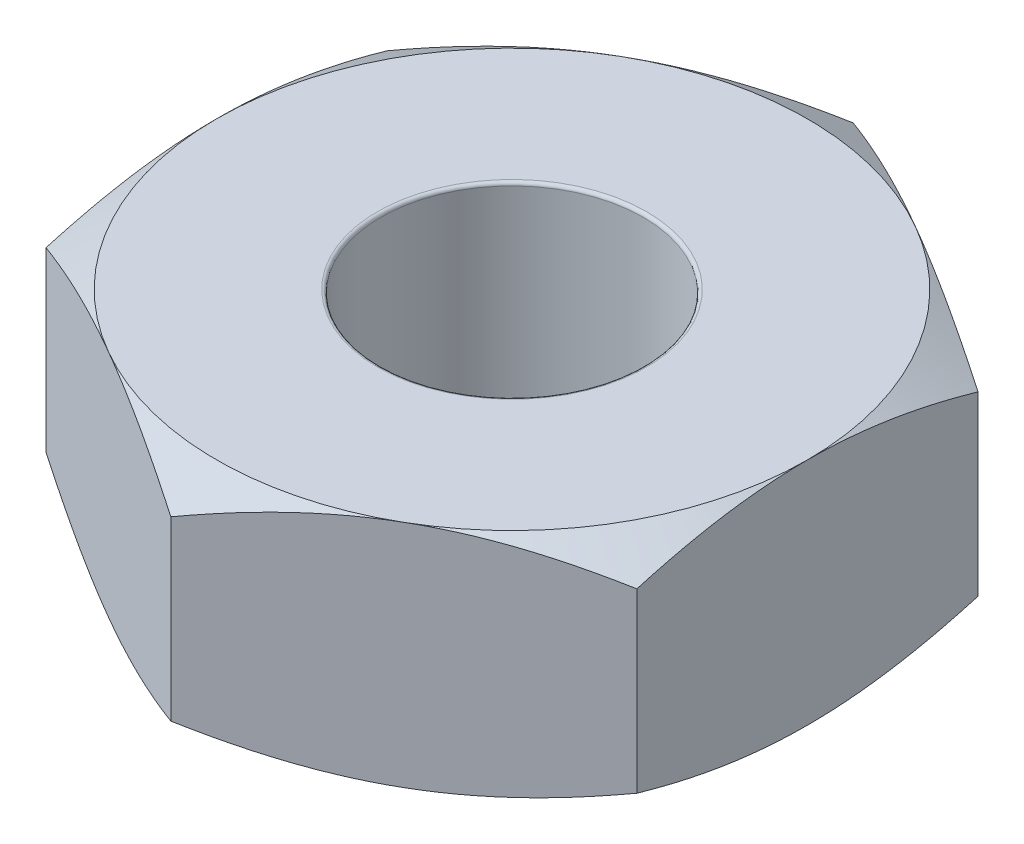
ISO-10303-21;
HEADER;
FILE_DESCRIPTION(('STEP AP214'),'2;1');
FILE_NAME('part.step','',(''),(''),'','','');
FILE_SCHEMA(('AUTOMOTIVE_DESIGN { 1 0 10303 214 1 1 1 1 }'));
ENDSEC;
DATA;
#1=APPLICATION_CONTEXT('core data for automotive mechanical design processes');
#2=APPLICATION_PROTOCOL_DEFINITION('international standard','automotive_design',2000,#1);
#3=PRODUCT_CONTEXT('',#1,'mechanical');
#4=PRODUCT('Part','Part','',(#3));
#5=PRODUCT_RELATED_PRODUCT_CATEGORY('part','',(#4));
#6=PRODUCT_DEFINITION_FORMATION('','',#4);
#7=PRODUCT_DEFINITION_CONTEXT('part definition',#1,'design');
#8=PRODUCT_DEFINITION('design','',#6,#7);
#9=PRODUCT_DEFINITION_SHAPE('','',#8);
#10=(LENGTH_UNIT() NAMED_UNIT(*) SI_UNIT(.MILLI.,.METRE.));
#11=(NAMED_UNIT(*) PLANE_ANGLE_UNIT() SI_UNIT($,.RADIAN.));
#12=(NAMED_UNIT(*) SI_UNIT($,.STERADIAN.) SOLID_ANGLE_UNIT());
#13=UNCERTAINTY_MEASURE_WITH_UNIT(LENGTH_MEASURE(1.E-05),#10,'distance_accuracy_value','');
#14=(GEOMETRIC_REPRESENTATION_CONTEXT(3) GLOBAL_UNCERTAINTY_ASSIGNED_CONTEXT((#13)) GLOBAL_UNIT_ASSIGNED_CONTEXT((#10,
#11,#12)) REPRESENTATION_CONTEXT('',''));
#15=CARTESIAN_POINT('',(0.,0.,0.));
#16=DIRECTION('',(0.,0.,1.));
#17=DIRECTION('',(1.,0.,0.));
#18=AXIS2_PLACEMENT_3D('',#15,#16,#17);
#19=CARTESIAN_POINT('',(-2.25,1.75,1.29903810567666));
#20=DIRECTION('',(0.5,0.,-0.866025403784439));
#21=DIRECTION('',(-0.866025403784439,0.,-0.5));
#22=AXIS2_PLACEMENT_3D('',#19,#20,#21);
#23=PLANE('',#22);
#24=CARTESIAN_POINT('',(0.000200000000000756,0.201028565434255,2.59819168140715));
#25=CARTESIAN_POINT('',(-0.0986772488143564,0.168055578047864,2.54110487518746));
#26=CARTESIAN_POINT('',(-0.198407997179093,0.138067535415598,2.48352530077259));
#27=CARTESIAN_POINT('',(-0.399596540220632,0.0857223882308779,2.36736904128969));
#28=CARTESIAN_POINT('',(-0.501057910502945,0.0633838027064786,2.30879029184485));
#29=CARTESIAN_POINT('',(-0.702723189801078,0.0286095576734189,2.19235878855587));
#30=CARTESIAN_POINT('',(-0.802896064976671,0.0159424738337184,2.13452395210774));
#31=CARTESIAN_POINT('',(-1.00371331260268,0.000818907417418956,2.01858206013295));
#32=CARTESIAN_POINT('',(-1.1043569548332,-0.00165009697600152,1.96047542619893));
#33=CARTESIAN_POINT('',(-1.29242516452656,0.00347837463602921,1.85189419470646));
#34=CARTESIAN_POINT('',(-1.37987784389126,0.00981663451512024,1.8014033667339));
#35=CARTESIAN_POINT('',(-1.55421343210877,0.0299076571898889,1.70075066794718));
#36=CARTESIAN_POINT('',(-1.64109573768829,0.0436672872310835,1.65058914543304));
#37=CARTESIAN_POINT('',(-1.81579095410174,0.0780662653506654,1.54972881521059));
#38=CARTESIAN_POINT('',(-1.90358174743525,0.0988514715826555,1.49904277704711));
#39=CARTESIAN_POINT('',(-2.07785373687759,0.146026087362979,1.39842679703037));
#40=CARTESIAN_POINT('',(-2.164337166751,0.172404408014302,1.34849556551251));
#41=CARTESIAN_POINT('',(-2.2502,0.201028565434254,1.29892263562282));
#42=B_SPLINE_CURVE_WITH_KNOTS('',3,(#24,#25,#26,#27,#28,#29,#30,#31,#32,#33,#34,#35,#36,#37,#38,
#39,#40,#41),.UNSPECIFIED.,.F.,.F.,(4,2,2,2,2,2,2,2,4),(0.,0.356658826016552,0.714175103224236,
1.06284241804968,1.41108149062516,1.71433394539794,2.01786749258222,2.32813511279245,
2.63779325460359),.UNSPECIFIED.);
#43=CARTESIAN_POINT('',(0.,0.200961894323341,2.59807621135332));
#44=VERTEX_POINT('',#43);
#45=CARTESIAN_POINT('',(-1.125,0.,1.94855715851499));
#46=VERTEX_POINT('',#45);
#47=EDGE_CURVE('E145',#44,#46,#42,.T.);
#48=ORIENTED_EDGE('',*,*,#47,.F.);
#49=DIRECTION('',(0.,-1.,0.));
#50=VECTOR('',#49,1.);
#51=CARTESIAN_POINT('',(0.,1.75,2.59807621135332));
#52=LINE('',#51,#50);
#53=CARTESIAN_POINT('',(0.,1.54903810567666,2.59807621135332));
#54=VERTEX_POINT('',#53);
#55=EDGE_CURVE('E160',#54,#44,#52,.T.);
#56=ORIENTED_EDGE('',*,*,#55,.F.);
#57=CARTESIAN_POINT('',(-2.2502,1.54897143456575,1.29892263562282));
#58=CARTESIAN_POINT('',(-2.15132275118564,1.58194442195214,1.35600944184252));
#59=CARTESIAN_POINT('',(-2.05159200282091,1.6119324645844,1.41358901625738));
#60=CARTESIAN_POINT('',(-1.85040345977937,1.66427761176912,1.52974527574028));
#61=CARTESIAN_POINT('',(-1.74894208949705,1.68661619729352,1.58832402518513));
#62=CARTESIAN_POINT('',(-1.54727681019892,1.72139044232658,1.7047555284741));
#63=CARTESIAN_POINT('',(-1.44710393502333,1.73405752616628,1.76259036492223));
#64=CARTESIAN_POINT('',(-1.24628668739732,1.74918109258258,1.87853225689702));
#65=CARTESIAN_POINT('',(-1.1456430451668,1.751650096976,1.93663889083104));
#66=CARTESIAN_POINT('',(-0.957574835473435,1.74652162536397,2.04522012232352));
#67=CARTESIAN_POINT('',(-0.870122156108742,1.74018336548488,2.09571095029608));
#68=CARTESIAN_POINT('',(-0.695786567891226,1.72009234281011,2.19636364908279));
#69=CARTESIAN_POINT('',(-0.608904262311711,1.70633271276892,2.24652517159694));
#70=CARTESIAN_POINT('',(-0.434209045898263,1.67193373464933,2.34738550181938));
#71=CARTESIAN_POINT('',(-0.346418252564746,1.65114852841734,2.39807153998286));
#72=CARTESIAN_POINT('',(-0.172146263122404,1.60397391263702,2.49868751999961));
#73=CARTESIAN_POINT('',(-0.0856628332489969,1.5775955919857,2.54861875151746));
#74=CARTESIAN_POINT('',(0.000200000000000693,1.54897143456575,2.59819168140715));
#75=B_SPLINE_CURVE_WITH_KNOTS('',3,(#57,#58,#59,#60,#61,#62,#63,#64,#65,#66,#67,#68,#69,#70,#71,
#72,#73,#74),.UNSPECIFIED.,.F.,.F.,(4,2,2,2,2,2,2,2,4),(0.,0.356658826016552,0.714175103224236,
1.06284241804968,1.41108149062516,1.71433394539794,2.01786749258222,2.32813511279245,
2.63779325460359),.UNSPECIFIED.);
#76=CARTESIAN_POINT('',(-1.125,1.75,1.94855715851499));
#77=VERTEX_POINT('',#76);
#78=EDGE_CURVE('E224',#77,#54,#75,.T.);
#79=ORIENTED_EDGE('',*,*,#78,.F.);
#80=CARTESIAN_POINT('',(-2.25,1.54903810567666,1.29903810567667));
#81=VERTEX_POINT('',#80);
#82=EDGE_CURVE('E231',#81,#77,#75,.T.);
#83=ORIENTED_EDGE('',*,*,#82,.F.);
#84=DIRECTION('',(0.,-1.,0.));
#85=VECTOR('',#84,1.);
#86=CARTESIAN_POINT('',(-2.25,1.75,1.29903810567666));
#87=LINE('',#86,#85);
#88=CARTESIAN_POINT('',(-2.25,0.200961894323341,1.29903810567666));
#89=VERTEX_POINT('',#88);
#90=EDGE_CURVE('E239',#81,#89,#87,.T.);
#91=ORIENTED_EDGE('',*,*,#90,.T.);
#92=EDGE_CURVE('E213',#46,#89,#42,.T.);
#93=ORIENTED_EDGE('',*,*,#92,.F.);
#94=EDGE_LOOP('',(#48,#56,#79,#83,#91,#93));
#95=FACE_BOUND('',#94,.T.);
#96=ADVANCED_FACE('F35',(#95),#23,.F.);
#97=CARTESIAN_POINT('',(0.,1.75,2.59807621135332));
#98=DIRECTION('',(-0.5,0.,-0.866025403784439));
#99=DIRECTION('',(-0.866025403784439,0.,0.5));
#100=AXIS2_PLACEMENT_3D('',#97,#98,#99);
#101=PLANE('',#100);
#102=CARTESIAN_POINT('',(2.2502,0.201028565434255,1.29892263562282));
#103=CARTESIAN_POINT('',(2.15132275118564,0.168055578047864,1.35600944184252));
#104=CARTESIAN_POINT('',(2.05159200282091,0.138067535415598,1.41358901625738));
#105=CARTESIAN_POINT('',(1.85040345977937,0.0857223882308783,1.52974527574028));
#106=CARTESIAN_POINT('',(1.74894208949705,0.063383802706479,1.58832402518513));
#107=CARTESIAN_POINT('',(1.54727681019892,0.0286095576734192,1.7047555284741));
#108=CARTESIAN_POINT('',(1.44710393502333,0.0159424738337187,1.76259036492223));
#109=CARTESIAN_POINT('',(1.24628668739732,0.000818907417419334,1.87853225689703));
#110=CARTESIAN_POINT('',(1.1456430451668,-0.00165009697600091,1.93663889083104));
#111=CARTESIAN_POINT('',(0.957574835473435,0.00347837463602974,2.04522012232352));
#112=CARTESIAN_POINT('',(0.870122156108742,0.00981663451512054,2.09571095029608));
#113=CARTESIAN_POINT('',(0.695786567891227,0.0299076571898892,2.19636364908279));
#114=CARTESIAN_POINT('',(0.608904262311713,0.0436672872310839,2.24652517159694));
#115=CARTESIAN_POINT('',(0.434209045898265,0.0780662653506659,2.34738550181938));
#116=CARTESIAN_POINT('',(0.346418252564747,0.0988514715826558,2.39807153998286));
#117=CARTESIAN_POINT('',(0.172146263122406,0.146026087362979,2.49868751999961));
#118=CARTESIAN_POINT('',(0.0856628332489987,0.172404408014302,2.54861875151746));
#119=CARTESIAN_POINT('',(-0.000199999999999222,0.201028565434255,2.59819168140715));
#120=B_SPLINE_CURVE_WITH_KNOTS('',3,(#102,#103,#104,#105,#106,#107,#108,#109,#110,#111,#112,
#113,#114,#115,#116,#117,#118,#119),.UNSPECIFIED.,.F.,.F.,(4,2,2,2,2,2,2,2,4),(0.,
0.356658826016552,0.714175103224236,1.06284241804968,1.41108149062516,1.71433394539794,
2.01786749258222,2.32813511279245,2.63779325460359),.UNSPECIFIED.);
#121=CARTESIAN_POINT('',(2.25,0.200961894323341,1.29903810567666));
#122=VERTEX_POINT('',#121);
#123=CARTESIAN_POINT('',(1.125,0.,1.94855715851499));
#124=VERTEX_POINT('',#123);
#125=EDGE_CURVE('E124',#122,#124,#120,.T.);
#126=ORIENTED_EDGE('',*,*,#125,.F.);
#127=DIRECTION('',(0.,-1.,0.));
#128=VECTOR('',#127,1.);
#129=CARTESIAN_POINT('',(2.25,1.75,1.29903810567666));
#130=LINE('',#129,#128);
#131=CARTESIAN_POINT('',(2.25,1.54903810567666,1.29903810567666));
#132=VERTEX_POINT('',#131);
#133=EDGE_CURVE('E251',#132,#122,#130,.T.);
#134=ORIENTED_EDGE('',*,*,#133,.F.);
#135=CARTESIAN_POINT('',(-0.000199999999999207,1.54897143456575,2.59819168140715));
#136=CARTESIAN_POINT('',(0.0986772488143579,1.58194442195214,2.54110487518746));
#137=CARTESIAN_POINT('',(0.198407997179094,1.6119324645844,2.48352530077259));
#138=CARTESIAN_POINT('',(0.399596540220633,1.66427761176912,2.36736904128969));
#139=CARTESIAN_POINT('',(0.501057910502946,1.68661619729352,2.30879029184485));
#140=CARTESIAN_POINT('',(0.702723189801079,1.72139044232658,2.19235878855587));
#141=CARTESIAN_POINT('',(0.802896064976673,1.73405752616628,2.13452395210774));
#142=CARTESIAN_POINT('',(1.00371331260268,1.74918109258258,2.01858206013295));
#143=CARTESIAN_POINT('',(1.1043569548332,1.751650096976,1.96047542619893));
#144=CARTESIAN_POINT('',(1.29242516452657,1.74652162536397,1.85189419470646));
#145=CARTESIAN_POINT('',(1.37987784389126,1.74018336548488,1.8014033667339));
#146=CARTESIAN_POINT('',(1.55421343210877,1.72009234281011,1.70075066794718));
#147=CARTESIAN_POINT('',(1.64109573768829,1.70633271276892,1.65058914543304));
#148=CARTESIAN_POINT('',(1.81579095410174,1.67193373464933,1.54972881521059));
#149=CARTESIAN_POINT('',(1.90358174743525,1.65114852841734,1.49904277704711));
#150=CARTESIAN_POINT('',(2.0778537368776,1.60397391263702,1.39842679703037));
#151=CARTESIAN_POINT('',(2.164337166751,1.5775955919857,1.34849556551251));
#152=CARTESIAN_POINT('',(2.2502,1.54897143456575,1.29892263562282));
#153=B_SPLINE_CURVE_WITH_KNOTS('',3,(#135,#136,#137,#138,#139,#140,#141,#142,#143,#144,#145,
#146,#147,#148,#149,#150,#151,#152),.UNSPECIFIED.,.F.,.F.,(4,2,2,2,2,2,2,2,4),(0.,
0.356658826016552,0.714175103224236,1.06284241804968,1.41108149062516,1.71433394539794,
2.01786749258222,2.32813511279245,2.63779325460359),.UNSPECIFIED.);
#154=CARTESIAN_POINT('',(1.125,1.75,1.94855715851499));
#155=VERTEX_POINT('',#154);
#156=EDGE_CURVE('E233',#155,#132,#153,.T.);
#157=ORIENTED_EDGE('',*,*,#156,.F.);
#158=EDGE_CURVE('E232',#54,#155,#153,.T.);
#159=ORIENTED_EDGE('',*,*,#158,.F.);
#160=ORIENTED_EDGE('',*,*,#55,.T.);
#161=EDGE_CURVE('E137',#124,#44,#120,.T.);
#162=ORIENTED_EDGE('',*,*,#161,.F.);
#163=EDGE_LOOP('',(#126,#134,#157,#159,#160,#162));
#164=FACE_BOUND('',#163,.T.);
#165=ADVANCED_FACE('F157',(#164),#101,.F.);
#166=CARTESIAN_POINT('',(2.25,1.75,1.29903810567666));
#167=DIRECTION('',(-1.,0.,0.));
#168=DIRECTION('',(0.,0.,1.));
#169=AXIS2_PLACEMENT_3D('',#166,#167,#168);
#170=PLANE('',#169);
#171=CARTESIAN_POINT('',(2.25,1.56555831138049,-4.42213047046897));
#172=CARTESIAN_POINT('',(2.25,1.51253641089187,-4.31907609605377));
#173=CARTESIAN_POINT('',(2.25,1.45980461522268,-4.21587114895435));
#174=CARTESIAN_POINT('',(2.25,1.35506687206804,-4.00909136564838));
#175=CARTESIAN_POINT('',(2.25,1.30306093826251,-3.90551652251669));
#176=CARTESIAN_POINT('',(2.25,1.19983819414006,-3.69776226755876));
#177=CARTESIAN_POINT('',(2.25,1.14862281407765,-3.59358214386062));
#178=CARTESIAN_POINT('',(2.25,1.04726863927474,-3.38469686395629));
#179=CARTESIAN_POINT('',(2.25,0.997129859883961,-3.27999170029052));
#180=CARTESIAN_POINT('',(2.25,0.895590975392254,-3.06443773664851));
#181=CARTESIAN_POINT('',(2.25,0.844262813896654,-2.95355495083985));
#182=CARTESIAN_POINT('',(2.25,0.743488704008481,-2.73093810810308));
#183=CARTESIAN_POINT('',(2.25,0.694042704613714,-2.6192040743404));
#184=CARTESIAN_POINT('',(2.25,0.597606517380621,-2.39476559407176));
#185=CARTESIAN_POINT('',(2.25,0.550614681662905,-2.28206185948416));
#186=CARTESIAN_POINT('',(2.25,0.459779963230871,-2.05535508627361));
#187=CARTESIAN_POINT('',(2.25,0.415937817282044,-1.94135175083155));
#188=CARTESIAN_POINT('',(2.25,0.325629065729293,-1.69318584033386));
#189=CARTESIAN_POINT('',(2.25,0.279891243493501,-1.55875423344575));
#190=CARTESIAN_POINT('',(2.25,0.196186335346582,-1.28751781965287));
#191=CARTESIAN_POINT('',(2.25,0.158215303092899,-1.15071425647396));
#192=CARTESIAN_POINT('',(2.25,0.0934100246854139,-0.877191892519576));
#193=CARTESIAN_POINT('',(2.25,0.0663767276583869,-0.74052148124589));
#194=CARTESIAN_POINT('',(2.25,0.0252694807344893,-0.465223193243969));
#195=CARTESIAN_POINT('',(2.25,0.0111879530299646,-0.326596509361764));
#196=CARTESIAN_POINT('',(2.25,0.00112514059449648,-0.117223951792124));
#197=CARTESIAN_POINT('',(2.25,-0.000357653579398746,-0.0467155663666338));
#198=CARTESIAN_POINT('',(2.25,0.000502767822567237,0.0942778450423073));
#199=CARTESIAN_POINT('',(2.25,0.00284598504344014,0.164762871015702));
#200=CARTESIAN_POINT('',(2.25,0.0155320953718862,0.375901114139416));
#201=CARTESIAN_POINT('',(2.25,0.0315313215434617,0.516240180351075));
#202=CARTESIAN_POINT('',(2.25,0.076927586603595,0.797536431240899));
#203=CARTESIAN_POINT('',(2.25,0.106589144783226,0.938448674669497));
#204=CARTESIAN_POINT('',(2.25,0.176240629866023,1.21767236088611));
#205=CARTESIAN_POINT('',(2.25,0.216233678272229,1.35598300406735));
#206=CARTESIAN_POINT('',(2.25,0.301848870671621,1.62417819674141));
#207=CARTESIAN_POINT('',(2.25,0.34714996058763,1.75416736002763));
#208=CARTESIAN_POINT('',(2.25,0.44280152310107,2.01228919589807));
#209=CARTESIAN_POINT('',(2.25,0.493153199709669,2.14042141743363));
#210=CARTESIAN_POINT('',(2.25,0.597611255264981,2.39528540480933));
#211=CARTESIAN_POINT('',(2.25,0.651721394221921,2.52201561679053));
#212=CARTESIAN_POINT('',(2.25,0.762705830640598,2.77426151692868));
#213=CARTESIAN_POINT('',(2.25,0.819580277044825,2.89977713920496));
#214=CARTESIAN_POINT('',(2.25,0.932150499113664,3.14277870156181));
#215=CARTESIAN_POINT('',(2.25,0.987731600848742,3.26031797968369));
#216=CARTESIAN_POINT('',(2.25,1.10035122751633,3.49469938792213));
#217=CARTESIAN_POINT('',(2.25,1.15738979940018,3.61154149542992));
#218=CARTESIAN_POINT('',(2.25,1.27243073348915,3.84427750639044));
#219=CARTESIAN_POINT('',(2.25,1.33042936901701,3.96017325620989));
#220=CARTESIAN_POINT('',(2.25,1.44735195230743,4.19148501960206));
#221=CARTESIAN_POINT('',(2.25,1.5062758208671,4.30690107318009));
#222=CARTESIAN_POINT('',(2.25,1.56555831138049,4.42213047046897));
#223=B_SPLINE_CURVE_WITH_KNOTS('',3,(#171,#172,#173,#174,#175,#176,#177,#178,#179,#180,#181,
#182,#183,#184,#185,#186,#187,#188,#189,#190,#191,#192,#193,#194,#195,#196,#197,#198,#199,#200,
#201,#202,#203,#204,#205,#206,#207,#208,#209,#210,#211,#212,#213,#214,#215,#216,#217,#218,#219,
#220,#221,#222),.UNSPECIFIED.,.F.,.F.,(4,2,2,2,2,2,2,2,2,2,2,2,2,2,2,2,2,2,2,2,2,2,2,2,2,4),(0.,
0.347684660648865,0.695375865091879,1.04363591220691,1.39190092137216,1.75844707629515,
2.12498329159302,2.4912701408257,2.85764239361152,3.28347290105065,3.70908650157083,
4.12656251242164,4.54379411118024,4.75527202620087,4.96675003214744,5.38969802732589,
5.82120323135264,6.25283896092085,6.66567429964863,7.07860828930034,7.49196150428248,
7.90533701571904,8.29537955819919,8.68543468149341,9.07422449696779,9.46298121030579),.UNSPECIFIED.);
#224=CARTESIAN_POINT('',(2.25,0.200961894323341,-1.29903810567666));
#225=VERTEX_POINT('',#224);
#226=CARTESIAN_POINT('',(2.25,0.,0.));
#227=VERTEX_POINT('',#226);
#228=EDGE_CURVE('E50',#225,#227,#223,.T.);
#229=ORIENTED_EDGE('',*,*,#228,.F.);
#230=DIRECTION('',(0.,-1.,0.));
#231=VECTOR('',#230,1.);
#232=CARTESIAN_POINT('',(2.25,1.75,-1.29903810567666));
#233=LINE('',#232,#231);
#234=CARTESIAN_POINT('',(2.25,1.54903810567666,-1.29903810567666));
#235=VERTEX_POINT('',#234);
#236=EDGE_CURVE('E248',#235,#225,#233,.T.);
#237=ORIENTED_EDGE('',*,*,#236,.F.);
#238=CARTESIAN_POINT('',(2.25,0.184441688619511,4.42213047046897));
#239=CARTESIAN_POINT('',(2.25,0.237463589108125,4.31907609605377));
#240=CARTESIAN_POINT('',(2.25,0.290195384777319,4.21587114895435));
#241=CARTESIAN_POINT('',(2.25,0.394933127931959,4.00909136564838));
#242=CARTESIAN_POINT('',(2.25,0.446939061737493,3.90551652251669));
#243=CARTESIAN_POINT('',(2.25,0.550161805859938,3.69776226755876));
#244=CARTESIAN_POINT('',(2.25,0.601377185922349,3.59358214386062));
#245=CARTESIAN_POINT('',(2.25,0.702731360725255,3.38469686395628));
#246=CARTESIAN_POINT('',(2.25,0.752870140116039,3.27999170029052));
#247=CARTESIAN_POINT('',(2.25,0.854409024607746,3.06443773664851));
#248=CARTESIAN_POINT('',(2.25,0.905737186103346,2.95355495083985));
#249=CARTESIAN_POINT('',(2.25,1.00651129599152,2.73093810810308));
#250=CARTESIAN_POINT('',(2.25,1.05595729538629,2.6192040743404));
#251=CARTESIAN_POINT('',(2.25,1.15239348261938,2.39476559407176));
#252=CARTESIAN_POINT('',(2.25,1.19938531833709,2.28206185948416));
#253=CARTESIAN_POINT('',(2.25,1.29022003676913,2.05535508627361));
#254=CARTESIAN_POINT('',(2.25,1.33406218271796,1.94135175083155));
#255=CARTESIAN_POINT('',(2.25,1.42437093427071,1.69318584033386));
#256=CARTESIAN_POINT('',(2.25,1.4701087565065,1.55875423344575));
#257=CARTESIAN_POINT('',(2.25,1.55381366465342,1.28751781965287));
#258=CARTESIAN_POINT('',(2.25,1.5917846969071,1.15071425647396));
#259=CARTESIAN_POINT('',(2.25,1.65658997531459,0.877191892519575));
#260=CARTESIAN_POINT('',(2.25,1.68362327234161,0.740521481245889));
#261=CARTESIAN_POINT('',(2.25,1.72473051926551,0.465223193243969));
#262=CARTESIAN_POINT('',(2.25,1.73881204697004,0.326596509361764));
#263=CARTESIAN_POINT('',(2.25,1.7488748594055,0.117223951792123));
#264=CARTESIAN_POINT('',(2.25,1.7503576535794,0.0467155663666327));
#265=CARTESIAN_POINT('',(2.25,1.74949723217743,-0.0942778450423084));
#266=CARTESIAN_POINT('',(2.25,1.74715401495656,-0.164762871015702));
#267=CARTESIAN_POINT('',(2.25,1.73446790462811,-0.375901114139416));
#268=CARTESIAN_POINT('',(2.25,1.71846867845654,-0.516240180351076));
#269=CARTESIAN_POINT('',(2.25,1.67307241339641,-0.7975364312409));
#270=CARTESIAN_POINT('',(2.25,1.64341085521677,-0.938448674669498));
#271=CARTESIAN_POINT('',(2.25,1.57375937013398,-1.21767236088611));
#272=CARTESIAN_POINT('',(2.25,1.53376632172777,-1.35598300406735));
#273=CARTESIAN_POINT('',(2.25,1.44815112932838,-1.62417819674141));
#274=CARTESIAN_POINT('',(2.25,1.40285003941237,-1.75416736002763));
#275=CARTESIAN_POINT('',(2.25,1.30719847689893,-2.01228919589808));
#276=CARTESIAN_POINT('',(2.25,1.25684680029033,-2.14042141743363));
#277=CARTESIAN_POINT('',(2.25,1.15238874473502,-2.39528540480934));
#278=CARTESIAN_POINT('',(2.25,1.09827860577808,-2.52201561679053));
#279=CARTESIAN_POINT('',(2.25,0.987294169359401,-2.77426151692869));
#280=CARTESIAN_POINT('',(2.25,0.930419722955175,-2.89977713920496));
#281=CARTESIAN_POINT('',(2.25,0.817849500886336,-3.14277870156182));
#282=CARTESIAN_POINT('',(2.25,0.762268399151258,-3.26031797968369));
#283=CARTESIAN_POINT('',(2.25,0.649648772483665,-3.49469938792213));
#284=CARTESIAN_POINT('',(2.25,0.592610200599821,-3.61154149542992));
#285=CARTESIAN_POINT('',(2.25,0.477569266510853,-3.84427750639044));
#286=CARTESIAN_POINT('',(2.25,0.419570630982986,-3.96017325620989));
#287=CARTESIAN_POINT('',(2.25,0.302648047692569,-4.19148501960206));
#288=CARTESIAN_POINT('',(2.25,0.243724179132898,-4.30690107318009));
#289=CARTESIAN_POINT('',(2.25,0.184441688619511,-4.42213047046897));
#290=B_SPLINE_CURVE_WITH_KNOTS('',3,(#238,#239,#240,#241,#242,#243,#244,#245,#246,#247,#248,
#249,#250,#251,#252,#253,#254,#255,#256,#257,#258,#259,#260,#261,#262,#263,#264,#265,#266,#267,
#268,#269,#270,#271,#272,#273,#274,#275,#276,#277,#278,#279,#280,#281,#282,#283,#284,#285,#286,
#287,#288,#289),.UNSPECIFIED.,.F.,.F.,(4,2,2,2,2,2,2,2,2,2,2,2,2,2,2,2,2,2,2,2,2,2,2,2,2,4),(0.,
0.347684660648864,0.695375865091879,1.04363591220691,1.39190092137216,1.75844707629515,
2.12498329159302,2.4912701408257,2.85764239361152,3.28347290105065,3.70908650157083,
4.12656251242164,4.54379411118024,4.75527202620087,4.96675003214744,5.38969802732589,
5.82120323135264,6.25283896092085,6.66567429964863,7.07860828930034,7.49196150428248,
7.90533701571905,8.29537955819919,8.68543468149342,9.07422449696779,9.46298121030579),.UNSPECIFIED.);
#291=CARTESIAN_POINT('',(2.25,1.75,0.));
#292=VERTEX_POINT('',#291);
#293=EDGE_CURVE('E289',#292,#235,#290,.T.);
#294=ORIENTED_EDGE('',*,*,#293,.F.);
#295=EDGE_CURVE('E294',#132,#292,#290,.T.);
#296=ORIENTED_EDGE('',*,*,#295,.F.);
#297=ORIENTED_EDGE('',*,*,#133,.T.);
#298=EDGE_CURVE('E131',#227,#122,#223,.T.);
#299=ORIENTED_EDGE('',*,*,#298,.F.);
#300=EDGE_LOOP('',(#229,#237,#294,#296,#297,#299));
#301=FACE_BOUND('',#300,.T.);
#302=ADVANCED_FACE('F295',(#301),#170,.F.);
#303=CARTESIAN_POINT('',(2.25,1.75,-1.29903810567666));
#304=DIRECTION('',(-0.5,0.,0.866025403784439));
#305=DIRECTION('',(0.866025403784439,0.,0.5));
#306=AXIS2_PLACEMENT_3D('',#303,#304,#305);
#307=PLANE('',#306);
#308=CARTESIAN_POINT('',(-0.000200000000000446,0.201028565434254,-2.59819168140715));
#309=CARTESIAN_POINT('',(0.0986772488143568,0.168055578047863,-2.54110487518745));
#310=CARTESIAN_POINT('',(0.198407997179093,0.138067535415598,-2.48352530077259));
#311=CARTESIAN_POINT('',(0.399596540220632,0.0857223882308777,-2.36736904128969));
#312=CARTESIAN_POINT('',(0.501057910502945,0.0633838027064786,-2.30879029184485));
#313=CARTESIAN_POINT('',(0.702723189801078,0.0286095576734189,-2.19235878855587));
#314=CARTESIAN_POINT('',(0.802896064976672,0.0159424738337184,-2.13452395210774));
#315=CARTESIAN_POINT('',(1.00371331260268,0.00081890741741882,-2.01858206013295));
#316=CARTESIAN_POINT('',(1.1043569548332,-0.00165009697600173,-1.96047542619893));
#317=CARTESIAN_POINT('',(1.29242516452656,0.00347837463602904,-1.85189419470646));
#318=CARTESIAN_POINT('',(1.37987784389126,0.00981663451512015,-1.8014033667339));
#319=CARTESIAN_POINT('',(1.55421343210877,0.0299076571898889,-1.70075066794718));
#320=CARTESIAN_POINT('',(1.64109573768829,0.0436672872310834,-1.65058914543304));
#321=CARTESIAN_POINT('',(1.81579095410174,0.0780662653506653,-1.54972881521059));
#322=CARTESIAN_POINT('',(1.90358174743525,0.0988514715826554,-1.49904277704711));
#323=CARTESIAN_POINT('',(2.07785373687759,0.146026087362979,-1.39842679703037));
#324=CARTESIAN_POINT('',(2.164337166751,0.172404408014302,-1.34849556551251));
#325=CARTESIAN_POINT('',(2.2502,0.201028565434254,-1.29892263562282));
#326=B_SPLINE_CURVE_WITH_KNOTS('',3,(#308,#309,#310,#311,#312,#313,#314,#315,#316,#317,#318,
#319,#320,#321,#322,#323,#324,#325),.UNSPECIFIED.,.F.,.F.,(4,2,2,2,2,2,2,2,4),(0.,
0.356658826016552,0.714175103224236,1.06284241804968,1.41108149062516,1.71433394539794,
2.01786749258222,2.32813511279245,2.63779325460359),.UNSPECIFIED.);
#327=CARTESIAN_POINT('',(0.,0.200961894323341,-2.59807621135332));
#328=VERTEX_POINT('',#327);
#329=CARTESIAN_POINT('',(1.125,0.,-1.94855715851499));
#330=VERTEX_POINT('',#329);
#331=EDGE_CURVE('E58',#328,#330,#326,.T.);
#332=ORIENTED_EDGE('',*,*,#331,.F.);
#333=DIRECTION('',(0.,-1.,0.));
#334=VECTOR('',#333,1.);
#335=CARTESIAN_POINT('',(0.,1.75,-2.59807621135332));
#336=LINE('',#335,#334);
#337=CARTESIAN_POINT('',(0.,1.54903810567666,-2.59807621135332));
#338=VERTEX_POINT('',#337);
#339=EDGE_CURVE('E245',#338,#328,#336,.T.);
#340=ORIENTED_EDGE('',*,*,#339,.F.);
#341=CARTESIAN_POINT('',(2.2502,1.54897143456575,-1.29892263562282));
#342=CARTESIAN_POINT('',(2.15132275118564,1.58194442195214,-1.35600944184252));
#343=CARTESIAN_POINT('',(2.05159200282091,1.6119324645844,-1.41358901625738));
#344=CARTESIAN_POINT('',(1.85040345977937,1.66427761176912,-1.52974527574028));
#345=CARTESIAN_POINT('',(1.74894208949705,1.68661619729352,-1.58832402518513));
#346=CARTESIAN_POINT('',(1.54727681019892,1.72139044232658,-1.7047555284741));
#347=CARTESIAN_POINT('',(1.44710393502333,1.73405752616628,-1.76259036492223));
#348=CARTESIAN_POINT('',(1.24628668739732,1.74918109258258,-1.87853225689702));
#349=CARTESIAN_POINT('',(1.1456430451668,1.751650096976,-1.93663889083104));
#350=CARTESIAN_POINT('',(0.957574835473434,1.74652162536397,-2.04522012232352));
#351=CARTESIAN_POINT('',(0.870122156108742,1.74018336548488,-2.09571095029608));
#352=CARTESIAN_POINT('',(0.695786567891226,1.72009234281011,-2.19636364908279));
#353=CARTESIAN_POINT('',(0.608904262311711,1.70633271276892,-2.24652517159694));
#354=CARTESIAN_POINT('',(0.434209045898264,1.67193373464933,-2.34738550181938));
#355=CARTESIAN_POINT('',(0.346418252564746,1.65114852841734,-2.39807153998286));
#356=CARTESIAN_POINT('',(0.172146263122405,1.60397391263702,-2.49868751999961));
#357=CARTESIAN_POINT('',(0.0856628332489972,1.5775955919857,-2.54861875151746));
#358=CARTESIAN_POINT('',(-0.000200000000000367,1.54897143456575,-2.59819168140715));
#359=B_SPLINE_CURVE_WITH_KNOTS('',3,(#341,#342,#343,#344,#345,#346,#347,#348,#349,#350,#351,
#352,#353,#354,#355,#356,#357,#358),.UNSPECIFIED.,.F.,.F.,(4,2,2,2,2,2,2,2,4),(0.,
0.356658826016552,0.714175103224236,1.06284241804968,1.41108149062516,1.71433394539794,
2.01786749258222,2.32813511279245,2.63779325460359),.UNSPECIFIED.);
#360=CARTESIAN_POINT('',(1.125,1.75,-1.94855715851499));
#361=VERTEX_POINT('',#360);
#362=EDGE_CURVE('E283',#361,#338,#359,.T.);
#363=ORIENTED_EDGE('',*,*,#362,.F.);
#364=EDGE_CURVE('E288',#235,#361,#359,.T.);
#365=ORIENTED_EDGE('',*,*,#364,.F.);
#366=ORIENTED_EDGE('',*,*,#236,.T.);
#367=EDGE_CURVE('E136',#330,#225,#326,.T.);
#368=ORIENTED_EDGE('',*,*,#367,.F.);
#369=EDGE_LOOP('',(#332,#340,#363,#365,#366,#368));
#370=FACE_BOUND('',#369,.T.);
#371=ADVANCED_FACE('F270',(#370),#307,.F.);
#372=CARTESIAN_POINT('',(0.,1.75,-2.59807621135332));
#373=DIRECTION('',(0.5,0.,0.866025403784439));
#374=DIRECTION('',(0.866025403784439,0.,-0.5));
#375=AXIS2_PLACEMENT_3D('',#372,#373,#374);
#376=PLANE('',#375);
#377=CARTESIAN_POINT('',(-2.2502,0.201028565434254,-1.29892263562282));
#378=CARTESIAN_POINT('',(-2.15132275118564,0.168055578047864,-1.35600944184252));
#379=CARTESIAN_POINT('',(-2.05159200282091,0.138067535415598,-1.41358901625738));
#380=CARTESIAN_POINT('',(-1.85040345977937,0.0857223882308779,-1.52974527574028));
#381=CARTESIAN_POINT('',(-1.74894208949706,0.0633838027064785,-1.58832402518512));
#382=CARTESIAN_POINT('',(-1.54727681019892,0.0286095576734186,-1.7047555284741));
#383=CARTESIAN_POINT('',(-1.44710393502333,0.0159424738337181,-1.76259036492223));
#384=CARTESIAN_POINT('',(-1.24628668739732,0.000818907417418722,-1.87853225689702));
#385=CARTESIAN_POINT('',(-1.1456430451668,-0.00165009697600166,-1.93663889083104));
#386=CARTESIAN_POINT('',(-0.957574835473436,0.00347837463602898,-2.04522012232352));
#387=CARTESIAN_POINT('',(-0.870122156108743,0.00981663451511988,-2.09571095029608));
#388=CARTESIAN_POINT('',(-0.695786567891227,0.0299076571898885,-2.19636364908279));
#389=CARTESIAN_POINT('',(-0.608904262311712,0.0436672872310831,-2.24652517159694));
#390=CARTESIAN_POINT('',(-0.434209045898265,0.0780662653506651,-2.34738550181938));
#391=CARTESIAN_POINT('',(-0.346418252564747,0.0988514715826552,-2.39807153998286));
#392=CARTESIAN_POINT('',(-0.172146263122405,0.146026087362979,-2.49868751999961));
#393=CARTESIAN_POINT('',(-0.085662833248998,0.172404408014302,-2.54861875151746));
#394=CARTESIAN_POINT('',(0.000199999999999667,0.201028565434254,-2.59819168140715));
#395=B_SPLINE_CURVE_WITH_KNOTS('',3,(#377,#378,#379,#380,#381,#382,#383,#384,#385,#386,#387,
#388,#389,#390,#391,#392,#393,#394),.UNSPECIFIED.,.F.,.F.,(4,2,2,2,2,2,2,2,4),(0.,
0.356658826016552,0.714175103224236,1.06284241804968,1.41108149062516,1.71433394539794,
2.01786749258222,2.32813511279245,2.63779325460359),.UNSPECIFIED.);
#396=CARTESIAN_POINT('',(-2.25,0.200961894323335,-1.29903810567667));
#397=VERTEX_POINT('',#396);
#398=CARTESIAN_POINT('',(-1.125,0.,-1.94855715851499));
#399=VERTEX_POINT('',#398);
#400=EDGE_CURVE('E207',#397,#399,#395,.T.);
#401=ORIENTED_EDGE('',*,*,#400,.F.);
#402=DIRECTION('',(0.,-1.,0.));
#403=VECTOR('',#402,1.);
#404=CARTESIAN_POINT('',(-2.25,1.75,-1.29903810567666));
#405=LINE('',#404,#403);
#406=CARTESIAN_POINT('',(-2.25,1.54903810567666,-1.29903810567666));
#407=VERTEX_POINT('',#406);
#408=EDGE_CURVE('E242',#407,#397,#405,.T.);
#409=ORIENTED_EDGE('',*,*,#408,.F.);
#410=CARTESIAN_POINT('',(0.000199999999999599,1.54897143456575,-2.59819168140715));
#411=CARTESIAN_POINT('',(-0.0986772488143576,1.58194442195214,-2.54110487518745));
#412=CARTESIAN_POINT('',(-0.198407997179094,1.6119324645844,-2.48352530077259));
#413=CARTESIAN_POINT('',(-0.399596540220633,1.66427761176912,-2.36736904128969));
#414=CARTESIAN_POINT('',(-0.501057910502946,1.68661619729352,-2.30879029184485));
#415=CARTESIAN_POINT('',(-0.702723189801079,1.72139044232658,-2.19235878855587));
#416=CARTESIAN_POINT('',(-0.802896064976672,1.73405752616628,-2.13452395210774));
#417=CARTESIAN_POINT('',(-1.00371331260268,1.74918109258258,-2.01858206013295));
#418=CARTESIAN_POINT('',(-1.1043569548332,1.751650096976,-1.96047542619893));
#419=CARTESIAN_POINT('',(-1.29242516452657,1.74652162536397,-1.85189419470646));
#420=CARTESIAN_POINT('',(-1.37987784389126,1.74018336548488,-1.8014033667339));
#421=CARTESIAN_POINT('',(-1.55421343210877,1.72009234281011,-1.70075066794718));
#422=CARTESIAN_POINT('',(-1.64109573768829,1.70633271276892,-1.65058914543303));
#423=CARTESIAN_POINT('',(-1.81579095410174,1.67193373464933,-1.54972881521059));
#424=CARTESIAN_POINT('',(-1.90358174743525,1.65114852841734,-1.49904277704711));
#425=CARTESIAN_POINT('',(-2.0778537368776,1.60397391263702,-1.39842679703037));
#426=CARTESIAN_POINT('',(-2.164337166751,1.5775955919857,-1.34849556551251));
#427=CARTESIAN_POINT('',(-2.2502,1.54897143456575,-1.29892263562282));
#428=B_SPLINE_CURVE_WITH_KNOTS('',3,(#410,#411,#412,#413,#414,#415,#416,#417,#418,#419,#420,
#421,#422,#423,#424,#425,#426,#427),.UNSPECIFIED.,.F.,.F.,(4,2,2,2,2,2,2,2,4),(0.,
0.356658826016552,0.714175103224236,1.06284241804968,1.41108149062516,1.71433394539794,
2.01786749258222,2.32813511279245,2.63779325460359),.UNSPECIFIED.);
#429=CARTESIAN_POINT('',(-1.125,1.75,-1.94855715851499));
#430=VERTEX_POINT('',#429);
#431=EDGE_CURVE('E275',#430,#407,#428,.T.);
#432=ORIENTED_EDGE('',*,*,#431,.F.);
#433=EDGE_CURVE('E281',#338,#430,#428,.T.);
#434=ORIENTED_EDGE('',*,*,#433,.F.);
#435=ORIENTED_EDGE('',*,*,#339,.T.);
#436=EDGE_CURVE('E161',#399,#328,#395,.T.);
#437=ORIENTED_EDGE('',*,*,#436,.F.);
#438=EDGE_LOOP('',(#401,#409,#432,#434,#435,#437));
#439=FACE_BOUND('',#438,.T.);
#440=ADVANCED_FACE('F264',(#439),#376,.F.);
#441=CARTESIAN_POINT('',(-2.25,1.75,-1.29903810567666));
#442=DIRECTION('',(1.,0.,0.));
#443=DIRECTION('',(0.,0.,-1.));
#444=AXIS2_PLACEMENT_3D('',#441,#442,#443);
#445=PLANE('',#444);
#446=CARTESIAN_POINT('',(-2.25,1.56555831138049,4.42213047046897));
#447=CARTESIAN_POINT('',(-2.25,1.51253641089187,4.31907609605377));
#448=CARTESIAN_POINT('',(-2.25,1.45980461522268,4.21587114895435));
#449=CARTESIAN_POINT('',(-2.25,1.35506687206804,4.00909136564838));
#450=CARTESIAN_POINT('',(-2.25,1.30306093826251,3.90551652251669));
#451=CARTESIAN_POINT('',(-2.25,1.19983819414006,3.69776226755876));
#452=CARTESIAN_POINT('',(-2.25,1.14862281407765,3.59358214386062));
#453=CARTESIAN_POINT('',(-2.25,1.04726863927474,3.38469686395628));
#454=CARTESIAN_POINT('',(-2.25,0.99712985988396,3.27999170029052));
#455=CARTESIAN_POINT('',(-2.25,0.895590975392253,3.06443773664851));
#456=CARTESIAN_POINT('',(-2.25,0.844262813896654,2.95355495083985));
#457=CARTESIAN_POINT('',(-2.25,0.743488704008481,2.73093810810308));
#458=CARTESIAN_POINT('',(-2.25,0.694042704613714,2.6192040743404));
#459=CARTESIAN_POINT('',(-2.25,0.597606517380621,2.39476559407176));
#460=CARTESIAN_POINT('',(-2.25,0.550614681662905,2.28206185948416));
#461=CARTESIAN_POINT('',(-2.25,0.459779963230871,2.05535508627361));
#462=CARTESIAN_POINT('',(-2.25,0.415937817282044,1.94135175083155));
#463=CARTESIAN_POINT('',(-2.25,0.325629065729293,1.69318584033386));
#464=CARTESIAN_POINT('',(-2.25,0.279891243493502,1.55875423344575));
#465=CARTESIAN_POINT('',(-2.25,0.196186335346582,1.28751781965287));
#466=CARTESIAN_POINT('',(-2.25,0.158215303092898,1.15071425647396));
#467=CARTESIAN_POINT('',(-2.25,0.0934100246854137,0.877191892519575));
#468=CARTESIAN_POINT('',(-2.25,0.0663767276583869,0.74052148124589));
#469=CARTESIAN_POINT('',(-2.25,0.0252694807344894,0.465223193243969));
#470=CARTESIAN_POINT('',(-2.25,0.0111879530299646,0.326596509361764));
#471=CARTESIAN_POINT('',(-2.25,0.00112514059449647,0.117223951792124));
#472=CARTESIAN_POINT('',(-2.25,-0.000357653579398761,0.046715566366634));
#473=CARTESIAN_POINT('',(-2.25,0.00050276782256725,-0.0942778450423068));
#474=CARTESIAN_POINT('',(-2.25,0.00284598504344017,-0.164762871015701));
#475=CARTESIAN_POINT('',(-2.25,0.0155320953718862,-0.375901114139415));
#476=CARTESIAN_POINT('',(-2.25,0.0315313215434617,-0.516240180351074));
#477=CARTESIAN_POINT('',(-2.25,0.0769275866035949,-0.797536431240898));
#478=CARTESIAN_POINT('',(-2.25,0.106589144783226,-0.938448674669497));
#479=CARTESIAN_POINT('',(-2.25,0.176240629866023,-1.21767236088611));
#480=CARTESIAN_POINT('',(-2.25,0.216233678272229,-1.35598300406735));
#481=CARTESIAN_POINT('',(-2.25,0.301848870671621,-1.62417819674141));
#482=CARTESIAN_POINT('',(-2.25,0.34714996058763,-1.75416736002763));
#483=CARTESIAN_POINT('',(-2.25,0.44280152310107,-2.01228919589808));
#484=CARTESIAN_POINT('',(-2.25,0.493153199709669,-2.14042141743363));
#485=CARTESIAN_POINT('',(-2.25,0.597611255264981,-2.39528540480934));
#486=CARTESIAN_POINT('',(-2.25,0.651721394221922,-2.52201561679053));
#487=CARTESIAN_POINT('',(-2.25,0.762705830640599,-2.77426151692868));
#488=CARTESIAN_POINT('',(-2.25,0.819580277044825,-2.89977713920496));
#489=CARTESIAN_POINT('',(-2.25,0.932150499113664,-3.14277870156181));
#490=CARTESIAN_POINT('',(-2.25,0.987731600848741,-3.26031797968368));
#491=CARTESIAN_POINT('',(-2.25,1.10035122751633,-3.49469938792213));
#492=CARTESIAN_POINT('',(-2.25,1.15738979940018,-3.61154149542992));
#493=CARTESIAN_POINT('',(-2.25,1.27243073348915,-3.84427750639044));
#494=CARTESIAN_POINT('',(-2.25,1.33042936901701,-3.96017325620988));
#495=CARTESIAN_POINT('',(-2.25,1.44735195230743,-4.19148501960206));
#496=CARTESIAN_POINT('',(-2.25,1.5062758208671,-4.30690107318009));
#497=CARTESIAN_POINT('',(-2.25,1.56555831138049,-4.42213047046896));
#498=B_SPLINE_CURVE_WITH_KNOTS('',3,(#446,#447,#448,#449,#450,#451,#452,#453,#454,#455,#456,
#457,#458,#459,#460,#461,#462,#463,#464,#465,#466,#467,#468,#469,#470,#471,#472,#473,#474,#475,
#476,#477,#478,#479,#480,#481,#482,#483,#484,#485,#486,#487,#488,#489,#490,#491,#492,#493,#494,
#495,#496,#497),.UNSPECIFIED.,.F.,.F.,(4,2,2,2,2,2,2,2,2,2,2,2,2,2,2,2,2,2,2,2,2,2,2,2,2,4),(0.,
0.347684660648864,0.695375865091879,1.04363591220691,1.39190092137216,1.75844707629514,
2.12498329159302,2.4912701408257,2.85764239361152,3.28347290105065,3.70908650157083,
4.12656251242164,4.54379411118024,4.75527202620086,4.96675003214744,5.38969802732589,
5.82120323135264,6.25283896092085,6.66567429964863,7.07860828930034,7.49196150428248,
7.90533701571904,8.29537955819919,8.68543468149341,9.07422449696779,9.46298121030578),.UNSPECIFIED.);
#499=CARTESIAN_POINT('',(-2.25,0.,0.));
#500=VERTEX_POINT('',#499);
#501=EDGE_CURVE('E416',#89,#500,#498,.T.);
#502=ORIENTED_EDGE('',*,*,#501,.F.);
#503=ORIENTED_EDGE('',*,*,#90,.F.);
#504=CARTESIAN_POINT('',(-2.25,0.184441688619511,-4.42213047046896));
#505=CARTESIAN_POINT('',(-2.25,0.237463589108126,-4.31907609605377));
#506=CARTESIAN_POINT('',(-2.25,0.290195384777319,-4.21587114895434));
#507=CARTESIAN_POINT('',(-2.25,0.394933127931959,-4.00909136564838));
#508=CARTESIAN_POINT('',(-2.25,0.446939061737493,-3.90551652251669));
#509=CARTESIAN_POINT('',(-2.25,0.550161805859938,-3.69776226755876));
#510=CARTESIAN_POINT('',(-2.25,0.601377185922349,-3.59358214386062));
#511=CARTESIAN_POINT('',(-2.25,0.702731360725256,-3.38469686395628));
#512=CARTESIAN_POINT('',(-2.25,0.75287014011604,-3.27999170029052));
#513=CARTESIAN_POINT('',(-2.25,0.854409024607746,-3.0644377366485));
#514=CARTESIAN_POINT('',(-2.25,0.905737186103346,-2.95355495083985));
#515=CARTESIAN_POINT('',(-2.25,1.00651129599152,-2.73093810810307));
#516=CARTESIAN_POINT('',(-2.25,1.05595729538629,-2.61920407434039));
#517=CARTESIAN_POINT('',(-2.25,1.15239348261938,-2.39476559407176));
#518=CARTESIAN_POINT('',(-2.25,1.1993853183371,-2.28206185948415));
#519=CARTESIAN_POINT('',(-2.25,1.29022003676913,-2.05535508627361));
#520=CARTESIAN_POINT('',(-2.25,1.33406218271796,-1.94135175083154));
#521=CARTESIAN_POINT('',(-2.25,1.42437093427071,-1.69318584033385));
#522=CARTESIAN_POINT('',(-2.25,1.4701087565065,-1.55875423344574));
#523=CARTESIAN_POINT('',(-2.25,1.55381366465342,-1.28751781965287));
#524=CARTESIAN_POINT('',(-2.25,1.5917846969071,-1.15071425647396));
#525=CARTESIAN_POINT('',(-2.25,1.65658997531459,-0.877191892519573));
#526=CARTESIAN_POINT('',(-2.25,1.68362327234161,-0.740521481245888));
#527=CARTESIAN_POINT('',(-2.25,1.72473051926551,-0.465223193243967));
#528=CARTESIAN_POINT('',(-2.25,1.73881204697004,-0.326596509361762));
#529=CARTESIAN_POINT('',(-2.25,1.7488748594055,-0.117223951792122));
#530=CARTESIAN_POINT('',(-2.25,1.7503576535794,-0.0467155663666314));
#531=CARTESIAN_POINT('',(-2.25,1.74949723217743,0.0942778450423094));
#532=CARTESIAN_POINT('',(-2.25,1.74715401495656,0.164762871015703));
#533=CARTESIAN_POINT('',(-2.25,1.73446790462811,0.375901114139417));
#534=CARTESIAN_POINT('',(-2.25,1.71846867845654,0.516240180351077));
#535=CARTESIAN_POINT('',(-2.25,1.67307241339641,0.797536431240901));
#536=CARTESIAN_POINT('',(-2.25,1.64341085521677,0.9384486746695));
#537=CARTESIAN_POINT('',(-2.25,1.57375937013398,1.21767236088611));
#538=CARTESIAN_POINT('',(-2.25,1.53376632172777,1.35598300406735));
#539=CARTESIAN_POINT('',(-2.25,1.44815112932838,1.62417819674141));
#540=CARTESIAN_POINT('',(-2.25,1.40285003941237,1.75416736002763));
#541=CARTESIAN_POINT('',(-2.25,1.30719847689893,2.01228919589808));
#542=CARTESIAN_POINT('',(-2.25,1.25684680029033,2.14042141743363));
#543=CARTESIAN_POINT('',(-2.25,1.15238874473502,2.39528540480934));
#544=CARTESIAN_POINT('',(-2.25,1.09827860577808,2.52201561679053));
#545=CARTESIAN_POINT('',(-2.25,0.987294169359401,2.77426151692869));
#546=CARTESIAN_POINT('',(-2.25,0.930419722955175,2.89977713920496));
#547=CARTESIAN_POINT('',(-2.25,0.817849500886336,3.14277870156182));
#548=CARTESIAN_POINT('',(-2.25,0.762268399151258,3.26031797968369));
#549=CARTESIAN_POINT('',(-2.25,0.649648772483666,3.49469938792213));
#550=CARTESIAN_POINT('',(-2.25,0.592610200599822,3.61154149542992));
#551=CARTESIAN_POINT('',(-2.25,0.477569266510854,3.84427750639044));
#552=CARTESIAN_POINT('',(-2.25,0.419570630982987,3.96017325620989));
#553=CARTESIAN_POINT('',(-2.25,0.30264804769257,4.19148501960206));
#554=CARTESIAN_POINT('',(-2.25,0.243724179132899,4.30690107318009));
#555=CARTESIAN_POINT('',(-2.25,0.184441688619512,4.42213047046897));
#556=B_SPLINE_CURVE_WITH_KNOTS('',3,(#504,#505,#506,#507,#508,#509,#510,#511,#512,#513,#514,
#515,#516,#517,#518,#519,#520,#521,#522,#523,#524,#525,#526,#527,#528,#529,#530,#531,#532,#533,
#534,#535,#536,#537,#538,#539,#540,#541,#542,#543,#544,#545,#546,#547,#548,#549,#550,#551,#552,
#553,#554,#555),.UNSPECIFIED.,.F.,.F.,(4,2,2,2,2,2,2,2,2,2,2,2,2,2,2,2,2,2,2,2,2,2,2,2,2,4),(0.,
0.347684660648865,0.695375865091879,1.04363591220691,1.39190092137216,1.75844707629515,
2.12498329159303,2.4912701408257,2.85764239361152,3.28347290105065,3.70908650157083,
4.12656251242164,4.54379411118025,4.75527202620087,4.96675003214744,5.38969802732589,
5.82120323135265,6.25283896092085,6.66567429964863,7.07860828930035,7.49196150428248,
7.90533701571905,8.29537955819919,8.68543468149341,9.07422449696779,9.46298121030578),.UNSPECIFIED.);
#557=CARTESIAN_POINT('',(-2.25,1.75,0.));
#558=VERTEX_POINT('',#557);
#559=EDGE_CURVE('E254',#558,#81,#556,.T.);
#560=ORIENTED_EDGE('',*,*,#559,.F.);
#561=EDGE_CURVE('E149',#407,#558,#556,.T.);
#562=ORIENTED_EDGE('',*,*,#561,.F.);
#563=ORIENTED_EDGE('',*,*,#408,.T.);
#564=EDGE_CURVE('E198',#500,#397,#498,.T.);
#565=ORIENTED_EDGE('',*,*,#564,.F.);
#566=EDGE_LOOP('',(#502,#503,#560,#562,#563,#565));
#567=FACE_BOUND('',#566,.T.);
#568=ADVANCED_FACE('F260',(#567),#445,.F.);
#569=CARTESIAN_POINT('',(0.,0.,0.));
#570=DIRECTION('',(0.,1.,0.));
#571=DIRECTION('',(0.,0.,1.));
#572=AXIS2_PLACEMENT_3D('',#569,#570,#571);
#573=PLANE('',#572);
#574=CARTESIAN_POINT('',(0.,0.,0.));
#575=DIRECTION('',(0.,1.,0.));
#576=DIRECTION('',(0.,0.,1.));
#577=AXIS2_PLACEMENT_3D('',#574,#575,#576);
#578=CIRCLE('',#577,1.025);
#579=CARTESIAN_POINT('',(0.,0.,1.025));
#580=VERTEX_POINT('',#579);
#581=EDGE_CURVE('E154',#580,#580,#578,.T.);
#582=ORIENTED_EDGE('',*,*,#581,.T.);
#583=EDGE_LOOP('',(#582));
#584=FACE_BOUND('',#583,.T.);
#585=CARTESIAN_POINT('',(0.,0.,0.));
#586=DIRECTION('',(0.,1.,0.));
#587=DIRECTION('',(0.,0.,1.));
#588=AXIS2_PLACEMENT_3D('',#585,#586,#587);
#589=CIRCLE('',#588,2.25);
#590=EDGE_CURVE('E128',#124,#227,#589,.T.);
#591=ORIENTED_EDGE('',*,*,#590,.F.);
#592=EDGE_CURVE('E142',#46,#124,#589,.T.);
#593=ORIENTED_EDGE('',*,*,#592,.F.);
#594=EDGE_CURVE('E148',#500,#46,#589,.T.);
#595=ORIENTED_EDGE('',*,*,#594,.F.);
#596=EDGE_CURVE('E413',#399,#500,#589,.T.);
#597=ORIENTED_EDGE('',*,*,#596,.F.);
#598=EDGE_CURVE('E155',#330,#399,#589,.T.);
#599=ORIENTED_EDGE('',*,*,#598,.F.);
#600=CARTESIAN_POINT('',(0.,0.,0.));
#601=DIRECTION('',(0.,-1.,0.));
#602=DIRECTION('',(0.,0.,-1.));
#603=AXIS2_PLACEMENT_3D('',#600,#601,#602);
#604=CIRCLE('',#603,2.25);
#605=EDGE_CURVE('E153',#330,#227,#604,.T.);
#606=ORIENTED_EDGE('',*,*,#605,.T.);
#607=EDGE_LOOP('',(#591,#593,#595,#597,#599,#606));
#608=FACE_BOUND('',#607,.T.);
#609=ADVANCED_FACE('F151',(#584,#608),#573,.F.);
#610=CARTESIAN_POINT('',(0.,1.75,0.));
#611=DIRECTION('',(0.,1.,0.));
#612=DIRECTION('',(0.,0.,1.));
#613=AXIS2_PLACEMENT_3D('',#610,#611,#612);
#614=PLANE('',#613);
#615=CARTESIAN_POINT('',(0.,1.75,0.));
#616=DIRECTION('',(0.,1.,0.));
#617=DIRECTION('',(0.,0.,1.));
#618=AXIS2_PLACEMENT_3D('',#615,#616,#617);
#619=CIRCLE('',#618,1.025);
#620=CARTESIAN_POINT('',(0.,1.75,1.025));
#621=VERTEX_POINT('',#620);
#622=EDGE_CURVE('E12',#621,#621,#619,.F.);
#623=ORIENTED_EDGE('',*,*,#622,.T.);
#624=EDGE_LOOP('',(#623));
#625=FACE_BOUND('',#624,.T.);
#626=CARTESIAN_POINT('',(0.,1.75,0.));
#627=DIRECTION('',(0.,1.,0.));
#628=DIRECTION('',(0.,0.,1.));
#629=AXIS2_PLACEMENT_3D('',#626,#627,#628);
#630=CIRCLE('',#629,2.25);
#631=EDGE_CURVE('E307',#77,#155,#630,.T.);
#632=ORIENTED_EDGE('',*,*,#631,.T.);
#633=EDGE_CURVE('E282',#155,#292,#630,.T.);
#634=ORIENTED_EDGE('',*,*,#633,.T.);
#635=EDGE_CURVE('E316',#292,#361,#630,.T.);
#636=ORIENTED_EDGE('',*,*,#635,.T.);
#637=EDGE_CURVE('E327',#361,#430,#630,.T.);
#638=ORIENTED_EDGE('',*,*,#637,.T.);
#639=EDGE_CURVE('E329',#430,#558,#630,.T.);
#640=ORIENTED_EDGE('',*,*,#639,.T.);
#641=EDGE_CURVE('E328',#558,#77,#630,.T.);
#642=ORIENTED_EDGE('',*,*,#641,.T.);
#643=EDGE_LOOP('',(#632,#634,#636,#638,#640,#642));
#644=FACE_BOUND('',#643,.T.);
#645=ADVANCED_FACE('F323',(#625,#644),#614,.T.);
#646=CARTESIAN_POINT('',(0.,1.75,0.));
#647=DIRECTION('',(0.,-1.,0.));
#648=DIRECTION('',(0.,0.,-1.));
#649=AXIS2_PLACEMENT_3D('',#646,#647,#648);
#650=CYLINDRICAL_SURFACE('',#649,1.);
#651=CARTESIAN_POINT('',(0.,0.0250000000000001,0.));
#652=DIRECTION('',(0.,1.,0.));
#653=DIRECTION('',(0.,0.,1.));
#654=AXIS2_PLACEMENT_3D('',#651,#652,#653);
#655=CIRCLE('',#654,1.);
#656=CARTESIAN_POINT('',(0.,0.0250000000000001,1.));
#657=VERTEX_POINT('',#656);
#658=EDGE_CURVE('E43',#657,#657,#655,.F.);
#659=ORIENTED_EDGE('',*,*,#658,.T.);
#660=EDGE_LOOP('',(#659));
#661=FACE_BOUND('',#660,.T.);
#662=CARTESIAN_POINT('',(0.,1.725,0.));
#663=DIRECTION('',(0.,1.,0.));
#664=DIRECTION('',(0.,0.,1.));
#665=AXIS2_PLACEMENT_3D('',#662,#663,#664);
#666=CIRCLE('',#665,1.);
#667=CARTESIAN_POINT('',(0.,1.725,1.));
#668=VERTEX_POINT('',#667);
#669=EDGE_CURVE('E382',#668,#668,#666,.T.);
#670=ORIENTED_EDGE('',*,*,#669,.T.);
#671=EDGE_LOOP('',(#670));
#672=FACE_BOUND('',#671,.T.);
#673=ADVANCED_FACE('F368',(#661,#672),#650,.F.);
#674=CARTESIAN_POINT('',(0.,1.75,0.));
#675=DIRECTION('',(0.,-1.,0.));
#676=DIRECTION('',(0.,0.,1.));
#677=AXIS2_PLACEMENT_3D('',#674,#675,#676);
#678=CONICAL_SURFACE('',#677,2.25,1.0471975511966);
#679=ORIENTED_EDGE('',*,*,#82,.T.);
#680=ORIENTED_EDGE('',*,*,#641,.F.);
#681=ORIENTED_EDGE('',*,*,#559,.T.);
#682=EDGE_LOOP('',(#679,#680,#681));
#683=FACE_BOUND('',#682,.T.);
#684=ADVANCED_FACE('F190',(#683),#678,.T.);
#685=ORIENTED_EDGE('',*,*,#431,.T.);
#686=ORIENTED_EDGE('',*,*,#561,.T.);
#687=ORIENTED_EDGE('',*,*,#639,.F.);
#688=EDGE_LOOP('',(#685,#686,#687));
#689=FACE_BOUND('',#688,.T.);
#690=ADVANCED_FACE('F341',(#689),#678,.T.);
#691=ORIENTED_EDGE('',*,*,#362,.T.);
#692=ORIENTED_EDGE('',*,*,#433,.T.);
#693=ORIENTED_EDGE('',*,*,#637,.F.);
#694=EDGE_LOOP('',(#691,#692,#693));
#695=FACE_BOUND('',#694,.T.);
#696=ADVANCED_FACE('F334',(#695),#678,.T.);
#697=ORIENTED_EDGE('',*,*,#293,.T.);
#698=ORIENTED_EDGE('',*,*,#364,.T.);
#699=ORIENTED_EDGE('',*,*,#635,.F.);
#700=EDGE_LOOP('',(#697,#698,#699));
#701=FACE_BOUND('',#700,.T.);
#702=ADVANCED_FACE('F315',(#701),#678,.T.);
#703=ORIENTED_EDGE('',*,*,#156,.T.);
#704=ORIENTED_EDGE('',*,*,#295,.T.);
#705=ORIENTED_EDGE('',*,*,#633,.F.);
#706=EDGE_LOOP('',(#703,#704,#705));
#707=FACE_BOUND('',#706,.T.);
#708=ADVANCED_FACE('F353',(#707),#678,.T.);
#709=ORIENTED_EDGE('',*,*,#78,.T.);
#710=ORIENTED_EDGE('',*,*,#158,.T.);
#711=ORIENTED_EDGE('',*,*,#631,.F.);
#712=EDGE_LOOP('',(#709,#710,#711));
#713=FACE_BOUND('',#712,.T.);
#714=ADVANCED_FACE('F352',(#713),#678,.T.);
#715=CARTESIAN_POINT('',(0.,0.,0.));
#716=DIRECTION('',(0.,1.,0.));
#717=DIRECTION('',(0.,0.,-1.));
#718=AXIS2_PLACEMENT_3D('',#715,#716,#717);
#719=CONICAL_SURFACE('',#718,2.25,1.0471975511966);
#720=ORIENTED_EDGE('',*,*,#161,.T.);
#721=ORIENTED_EDGE('',*,*,#47,.T.);
#722=ORIENTED_EDGE('',*,*,#592,.T.);
#723=EDGE_LOOP('',(#720,#721,#722));
#724=FACE_BOUND('',#723,.T.);
#725=ADVANCED_FACE('F143',(#724),#719,.T.);
#726=ORIENTED_EDGE('',*,*,#92,.T.);
#727=ORIENTED_EDGE('',*,*,#501,.T.);
#728=ORIENTED_EDGE('',*,*,#594,.T.);
#729=EDGE_LOOP('',(#726,#727,#728));
#730=FACE_BOUND('',#729,.T.);
#731=ADVANCED_FACE('F399',(#730),#719,.T.);
#732=ORIENTED_EDGE('',*,*,#400,.T.);
#733=ORIENTED_EDGE('',*,*,#596,.T.);
#734=ORIENTED_EDGE('',*,*,#564,.T.);
#735=EDGE_LOOP('',(#732,#733,#734));
#736=FACE_BOUND('',#735,.T.);
#737=ADVANCED_FACE('F189',(#736),#719,.T.);
#738=ORIENTED_EDGE('',*,*,#331,.T.);
#739=ORIENTED_EDGE('',*,*,#598,.T.);
#740=ORIENTED_EDGE('',*,*,#436,.T.);
#741=EDGE_LOOP('',(#738,#739,#740));
#742=FACE_BOUND('',#741,.T.);
#743=ADVANCED_FACE('F188',(#742),#719,.T.);
#744=ORIENTED_EDGE('',*,*,#228,.T.);
#745=ORIENTED_EDGE('',*,*,#605,.F.);
#746=ORIENTED_EDGE('',*,*,#367,.T.);
#747=EDGE_LOOP('',(#744,#745,#746));
#748=FACE_BOUND('',#747,.T.);
#749=ADVANCED_FACE('F184',(#748),#719,.T.);
#750=ORIENTED_EDGE('',*,*,#298,.T.);
#751=ORIENTED_EDGE('',*,*,#125,.T.);
#752=ORIENTED_EDGE('',*,*,#590,.T.);
#753=EDGE_LOOP('',(#750,#751,#752));
#754=FACE_BOUND('',#753,.T.);
#755=ADVANCED_FACE('F126',(#754),#719,.T.);
#756=CARTESIAN_POINT('',(0.,0.0250000000000001,0.));
#757=DIRECTION('',(0.,1.,0.));
#758=DIRECTION('',(0.,0.,1.));
#759=AXIS2_PLACEMENT_3D('',#756,#757,#758);
#760=TOROIDAL_SURFACE('',#759,1.025,0.025);
#761=ORIENTED_EDGE('',*,*,#658,.F.);
#762=EDGE_LOOP('',(#761));
#763=FACE_BOUND('',#762,.T.);
#764=ORIENTED_EDGE('',*,*,#581,.F.);
#765=EDGE_LOOP('',(#764));
#766=FACE_BOUND('',#765,.T.);
#767=ADVANCED_FACE('F221',(#763,#766),#760,.T.);
#768=CARTESIAN_POINT('',(0.,1.725,0.));
#769=DIRECTION('',(0.,1.,0.));
#770=DIRECTION('',(0.,0.,1.));
#771=AXIS2_PLACEMENT_3D('',#768,#769,#770);
#772=TOROIDAL_SURFACE('',#771,1.025,0.025);
#773=ORIENTED_EDGE('',*,*,#622,.F.);
#774=EDGE_LOOP('',(#773));
#775=FACE_BOUND('',#774,.T.);
#776=ORIENTED_EDGE('',*,*,#669,.F.);
#777=EDGE_LOOP('',(#776));
#778=FACE_BOUND('',#777,.T.);
#779=ADVANCED_FACE('F37',(#775,#778),#772,.T.);
#780=CLOSED_SHELL('',(#96,#165,#302,#371,#440,#568,#609,#645,#673,#684,#690,#696,#702,#708,#714,
#725,#731,#737,#743,#749,#755,#767,#779));
#781=MANIFOLD_SOLID_BREP('B2',#780);
#782=ADVANCED_BREP_SHAPE_REPRESENTATION('',(#18,#781),#14);
#783=SHAPE_DEFINITION_REPRESENTATION(#9,#782);
ENDSEC;
END-ISO-10303-21;
